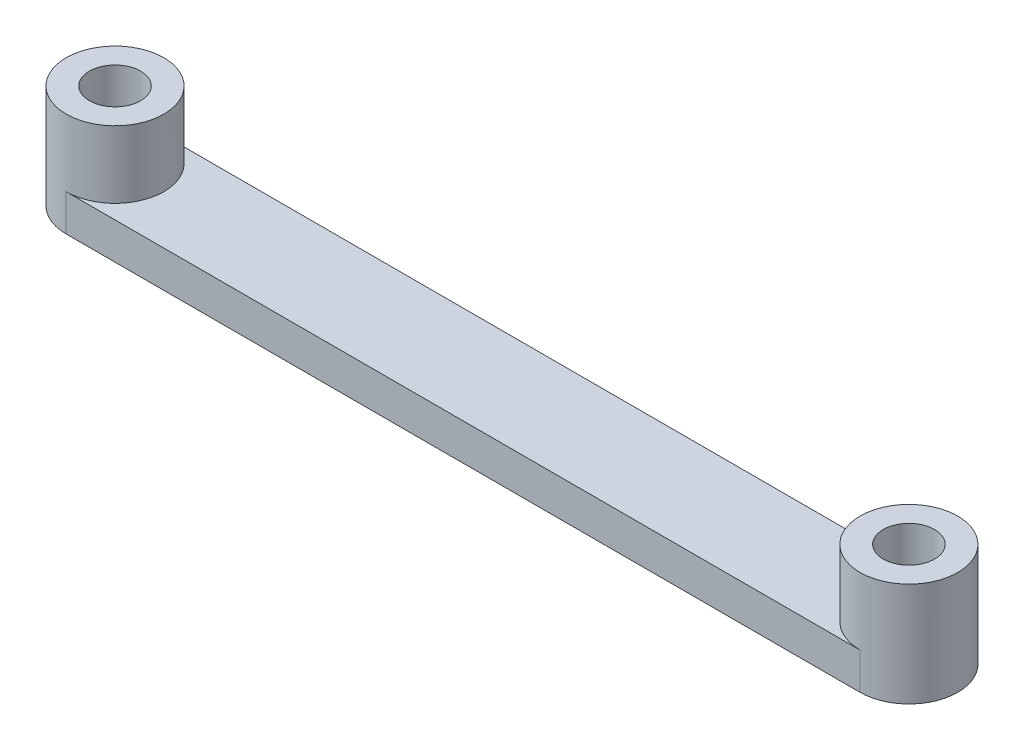
ISO-10303-21;
HEADER;
FILE_DESCRIPTION(('STEP AP214'),'2;1');
FILE_NAME('part.step','',(''),(''),'','','');
FILE_SCHEMA(('AUTOMOTIVE_DESIGN { 1 0 10303 214 1 1 1 1 }'));
ENDSEC;
DATA;
#1=APPLICATION_CONTEXT('core data for automotive mechanical design processes');
#2=APPLICATION_PROTOCOL_DEFINITION('international standard','automotive_design',2000,#1);
#3=PRODUCT_CONTEXT('',#1,'mechanical');
#4=PRODUCT('Part','Part','',(#3));
#5=PRODUCT_RELATED_PRODUCT_CATEGORY('part','',(#4));
#6=PRODUCT_DEFINITION_FORMATION('','',#4);
#7=PRODUCT_DEFINITION_CONTEXT('part definition',#1,'design');
#8=PRODUCT_DEFINITION('design','',#6,#7);
#9=PRODUCT_DEFINITION_SHAPE('','',#8);
#10=(LENGTH_UNIT() NAMED_UNIT(*) SI_UNIT(.MILLI.,.METRE.));
#11=(NAMED_UNIT(*) PLANE_ANGLE_UNIT() SI_UNIT($,.RADIAN.));
#12=(NAMED_UNIT(*) SI_UNIT($,.STERADIAN.) SOLID_ANGLE_UNIT());
#13=UNCERTAINTY_MEASURE_WITH_UNIT(LENGTH_MEASURE(1.E-05),#10,'distance_accuracy_value','');
#14=(GEOMETRIC_REPRESENTATION_CONTEXT(3) GLOBAL_UNCERTAINTY_ASSIGNED_CONTEXT((#13)) GLOBAL_UNIT_ASSIGNED_CONTEXT((#10,
#11,#12)) REPRESENTATION_CONTEXT('',''));
#15=CARTESIAN_POINT('',(0.,0.,0.));
#16=DIRECTION('',(0.,0.,1.));
#17=DIRECTION('',(1.,0.,0.));
#18=AXIS2_PLACEMENT_3D('',#15,#16,#17);
#19=CARTESIAN_POINT('',(0.,3.,0.));
#20=DIRECTION('',(0.,1.,0.));
#21=DIRECTION('',(0.,0.,1.));
#22=AXIS2_PLACEMENT_3D('',#19,#20,#21);
#23=PLANE('',#22);
#24=DIRECTION('',(1.,0.,0.));
#25=VECTOR('',#24,1.);
#26=CARTESIAN_POINT('',(0.,3.,4.));
#27=LINE('',#26,#25);
#28=CARTESIAN_POINT('',(0.,3.,4.));
#29=VERTEX_POINT('',#28);
#30=CARTESIAN_POINT('',(65.,3.,4.));
#31=VERTEX_POINT('',#30);
#32=EDGE_CURVE('E88',#29,#31,#27,.T.);
#33=ORIENTED_EDGE('',*,*,#32,.T.);
#34=CARTESIAN_POINT('',(65.,3.,0.));
#35=DIRECTION('',(0.,1.,0.));
#36=DIRECTION('',(0.,0.,1.));
#37=AXIS2_PLACEMENT_3D('',#34,#35,#36);
#38=CIRCLE('',#37,3.99999999999999);
#39=CARTESIAN_POINT('',(65.,3.,-3.99999999999999));
#40=VERTEX_POINT('',#39);
#41=EDGE_CURVE('E11',#31,#40,#38,.F.);
#42=ORIENTED_EDGE('',*,*,#41,.T.);
#43=DIRECTION('',(-1.,0.,0.));
#44=VECTOR('',#43,1.);
#45=CARTESIAN_POINT('',(0.,3.,-4.));
#46=LINE('',#45,#44);
#47=CARTESIAN_POINT('',(0.,3.,-4.));
#48=VERTEX_POINT('',#47);
#49=EDGE_CURVE('E56',#40,#48,#46,.T.);
#50=ORIENTED_EDGE('',*,*,#49,.T.);
#51=CARTESIAN_POINT('',(0.,3.,0.));
#52=DIRECTION('',(0.,1.,0.));
#53=DIRECTION('',(0.,0.,1.));
#54=AXIS2_PLACEMENT_3D('',#51,#52,#53);
#55=CIRCLE('',#54,4.);
#56=EDGE_CURVE('E95',#29,#48,#55,.T.);
#57=ORIENTED_EDGE('',*,*,#56,.F.);
#58=EDGE_LOOP('',(#33,#42,#50,#57));
#59=FACE_BOUND('',#58,.T.);
#60=ADVANCED_FACE('F39',(#59),#23,.T.);
#61=CARTESIAN_POINT('',(0.,3.,0.));
#62=DIRECTION('',(0.,-1.,0.));
#63=DIRECTION('',(0.,0.,-1.));
#64=AXIS2_PLACEMENT_3D('',#61,#62,#63);
#65=CYLINDRICAL_SURFACE('',#64,4.);
#66=CARTESIAN_POINT('',(0.,0.,0.));
#67=DIRECTION('',(0.,1.,0.));
#68=DIRECTION('',(0.,0.,1.));
#69=AXIS2_PLACEMENT_3D('',#66,#67,#68);
#70=CIRCLE('',#69,4.);
#71=CARTESIAN_POINT('',(0.,0.,-4.));
#72=VERTEX_POINT('',#71);
#73=CARTESIAN_POINT('',(0.,0.,4.));
#74=VERTEX_POINT('',#73);
#75=EDGE_CURVE('E94',#72,#74,#70,.T.);
#76=ORIENTED_EDGE('',*,*,#75,.T.);
#77=DIRECTION('',(0.,-1.,0.));
#78=VECTOR('',#77,1.);
#79=CARTESIAN_POINT('',(0.,3.,4.));
#80=LINE('',#79,#78);
#81=EDGE_CURVE('E49',#29,#74,#80,.T.);
#82=ORIENTED_EDGE('',*,*,#81,.F.);
#83=ORIENTED_EDGE('',*,*,#56,.T.);
#84=DIRECTION('',(0.,-1.,0.));
#85=VECTOR('',#84,1.);
#86=CARTESIAN_POINT('',(0.,3.,-4.));
#87=LINE('',#86,#85);
#88=EDGE_CURVE('E82',#48,#72,#87,.T.);
#89=ORIENTED_EDGE('',*,*,#88,.T.);
#90=EDGE_LOOP('',(#76,#82,#83,#89));
#91=FACE_BOUND('',#90,.T.);
#92=CARTESIAN_POINT('',(0.,8.5,0.));
#93=DIRECTION('',(0.,1.,0.));
#94=DIRECTION('',(0.,0.,1.));
#95=AXIS2_PLACEMENT_3D('',#92,#93,#94);
#96=CIRCLE('',#95,4.);
#97=CARTESIAN_POINT('',(0.,8.5,4.));
#98=VERTEX_POINT('',#97);
#99=EDGE_CURVE('E102',#98,#98,#96,.T.);
#100=ORIENTED_EDGE('',*,*,#99,.F.);
#101=EDGE_LOOP('',(#100));
#102=FACE_BOUND('',#101,.T.);
#103=ADVANCED_FACE('F41',(#91,#102),#65,.T.);
#104=CARTESIAN_POINT('',(0.,3.,4.));
#105=DIRECTION('',(0.,0.,-1.));
#106=DIRECTION('',(-1.,0.,0.));
#107=AXIS2_PLACEMENT_3D('',#104,#105,#106);
#108=PLANE('',#107);
#109=DIRECTION('',(1.,0.,0.));
#110=VECTOR('',#109,1.);
#111=CARTESIAN_POINT('',(0.,0.,4.));
#112=LINE('',#111,#110);
#113=CARTESIAN_POINT('',(65.,0.,4.));
#114=VERTEX_POINT('',#113);
#115=EDGE_CURVE('E99',#74,#114,#112,.T.);
#116=ORIENTED_EDGE('',*,*,#115,.T.);
#117=DIRECTION('',(0.,-1.,0.));
#118=VECTOR('',#117,1.);
#119=CARTESIAN_POINT('',(65.,3.,4.));
#120=LINE('',#119,#118);
#121=EDGE_CURVE('E116',#31,#114,#120,.T.);
#122=ORIENTED_EDGE('',*,*,#121,.F.);
#123=ORIENTED_EDGE('',*,*,#32,.F.);
#124=ORIENTED_EDGE('',*,*,#81,.T.);
#125=EDGE_LOOP('',(#116,#122,#123,#124));
#126=FACE_BOUND('',#125,.T.);
#127=ADVANCED_FACE('F121',(#126),#108,.F.);
#128=CARTESIAN_POINT('',(65.,3.,0.));
#129=DIRECTION('',(0.,-1.,0.));
#130=DIRECTION('',(0.,0.,-1.));
#131=AXIS2_PLACEMENT_3D('',#128,#129,#130);
#132=CYLINDRICAL_SURFACE('',#131,4.);
#133=CARTESIAN_POINT('',(65.,0.,0.));
#134=DIRECTION('',(0.,1.,0.));
#135=DIRECTION('',(0.,0.,1.));
#136=AXIS2_PLACEMENT_3D('',#133,#134,#135);
#137=CIRCLE('',#136,4.);
#138=CARTESIAN_POINT('',(65.,0.,-4.));
#139=VERTEX_POINT('',#138);
#140=EDGE_CURVE('E74',#114,#139,#137,.T.);
#141=ORIENTED_EDGE('',*,*,#140,.T.);
#142=DIRECTION('',(0.,-1.,0.));
#143=VECTOR('',#142,1.);
#144=CARTESIAN_POINT('',(65.,3.,-4.));
#145=LINE('',#144,#143);
#146=EDGE_CURVE('E84',#40,#139,#145,.T.);
#147=ORIENTED_EDGE('',*,*,#146,.F.);
#148=ORIENTED_EDGE('',*,*,#41,.F.);
#149=ORIENTED_EDGE('',*,*,#121,.T.);
#150=EDGE_LOOP('',(#141,#147,#148,#149));
#151=FACE_BOUND('',#150,.T.);
#152=CARTESIAN_POINT('',(65.,8.5,0.));
#153=DIRECTION('',(0.,1.,0.));
#154=DIRECTION('',(0.,0.,1.));
#155=AXIS2_PLACEMENT_3D('',#152,#153,#154);
#156=CIRCLE('',#155,3.99999999999999);
#157=CARTESIAN_POINT('',(65.,8.5,3.99999999999999));
#158=VERTEX_POINT('',#157);
#159=EDGE_CURVE('E132',#158,#158,#156,.T.);
#160=ORIENTED_EDGE('',*,*,#159,.F.);
#161=EDGE_LOOP('',(#160));
#162=FACE_BOUND('',#161,.T.);
#163=ADVANCED_FACE('F127',(#151,#162),#132,.T.);
#164=CARTESIAN_POINT('',(0.,3.,-4.));
#165=DIRECTION('',(0.,0.,1.));
#166=DIRECTION('',(1.,0.,0.));
#167=AXIS2_PLACEMENT_3D('',#164,#165,#166);
#168=PLANE('',#167);
#169=DIRECTION('',(-1.,0.,0.));
#170=VECTOR('',#169,1.);
#171=CARTESIAN_POINT('',(0.,0.,-4.));
#172=LINE('',#171,#170);
#173=EDGE_CURVE('E79',#139,#72,#172,.T.);
#174=ORIENTED_EDGE('',*,*,#173,.T.);
#175=ORIENTED_EDGE('',*,*,#88,.F.);
#176=ORIENTED_EDGE('',*,*,#49,.F.);
#177=ORIENTED_EDGE('',*,*,#146,.T.);
#178=EDGE_LOOP('',(#174,#175,#176,#177));
#179=FACE_BOUND('',#178,.T.);
#180=ADVANCED_FACE('F81',(#179),#168,.F.);
#181=CARTESIAN_POINT('',(0.,0.,0.));
#182=DIRECTION('',(0.,1.,0.));
#183=DIRECTION('',(0.,0.,1.));
#184=AXIS2_PLACEMENT_3D('',#181,#182,#183);
#185=PLANE('',#184);
#186=CARTESIAN_POINT('',(0.,0.,0.));
#187=DIRECTION('',(0.,1.,0.));
#188=DIRECTION('',(0.,0.,1.));
#189=AXIS2_PLACEMENT_3D('',#186,#187,#188);
#190=CIRCLE('',#189,2.1);
#191=CARTESIAN_POINT('',(0.,0.,2.1));
#192=VERTEX_POINT('',#191);
#193=EDGE_CURVE('E137',#192,#192,#190,.T.);
#194=ORIENTED_EDGE('',*,*,#193,.T.);
#195=EDGE_LOOP('',(#194));
#196=FACE_BOUND('',#195,.T.);
#197=CARTESIAN_POINT('',(65.,0.,0.));
#198=DIRECTION('',(0.,1.,0.));
#199=DIRECTION('',(0.,0.,1.));
#200=AXIS2_PLACEMENT_3D('',#197,#198,#199);
#201=CIRCLE('',#200,2.1);
#202=CARTESIAN_POINT('',(65.,0.,2.1));
#203=VERTEX_POINT('',#202);
#204=EDGE_CURVE('E142',#203,#203,#201,.T.);
#205=ORIENTED_EDGE('',*,*,#204,.T.);
#206=EDGE_LOOP('',(#205));
#207=FACE_BOUND('',#206,.T.);
#208=ORIENTED_EDGE('',*,*,#75,.F.);
#209=ORIENTED_EDGE('',*,*,#173,.F.);
#210=ORIENTED_EDGE('',*,*,#140,.F.);
#211=ORIENTED_EDGE('',*,*,#115,.F.);
#212=EDGE_LOOP('',(#208,#209,#210,#211));
#213=FACE_BOUND('',#212,.T.);
#214=ADVANCED_FACE('F98',(#196,#207,#213),#185,.F.);
#215=CARTESIAN_POINT('',(0.,8.5,0.));
#216=DIRECTION('',(0.,1.,0.));
#217=DIRECTION('',(0.,0.,1.));
#218=AXIS2_PLACEMENT_3D('',#215,#216,#217);
#219=PLANE('',#218);
#220=CARTESIAN_POINT('',(0.,8.5,0.));
#221=DIRECTION('',(0.,1.,0.));
#222=DIRECTION('',(0.,0.,1.));
#223=AXIS2_PLACEMENT_3D('',#220,#221,#222);
#224=CIRCLE('',#223,2.1);
#225=CARTESIAN_POINT('',(0.,8.5,2.1));
#226=VERTEX_POINT('',#225);
#227=EDGE_CURVE('E146',#226,#226,#224,.T.);
#228=ORIENTED_EDGE('',*,*,#227,.F.);
#229=EDGE_LOOP('',(#228));
#230=FACE_BOUND('',#229,.T.);
#231=ORIENTED_EDGE('',*,*,#99,.T.);
#232=EDGE_LOOP('',(#231));
#233=FACE_BOUND('',#232,.T.);
#234=ADVANCED_FACE('F163',(#230,#233),#219,.T.);
#235=CARTESIAN_POINT('',(65.,8.5,0.));
#236=DIRECTION('',(0.,1.,0.));
#237=DIRECTION('',(0.,0.,1.));
#238=AXIS2_PLACEMENT_3D('',#235,#236,#237);
#239=PLANE('',#238);
#240=CARTESIAN_POINT('',(65.,8.5,0.));
#241=DIRECTION('',(0.,1.,0.));
#242=DIRECTION('',(0.,0.,1.));
#243=AXIS2_PLACEMENT_3D('',#240,#241,#242);
#244=CIRCLE('',#243,2.1);
#245=CARTESIAN_POINT('',(65.,8.5,2.1));
#246=VERTEX_POINT('',#245);
#247=EDGE_CURVE('E138',#246,#246,#244,.T.);
#248=ORIENTED_EDGE('',*,*,#247,.F.);
#249=EDGE_LOOP('',(#248));
#250=FACE_BOUND('',#249,.T.);
#251=ORIENTED_EDGE('',*,*,#159,.T.);
#252=EDGE_LOOP('',(#251));
#253=FACE_BOUND('',#252,.T.);
#254=ADVANCED_FACE('F166',(#250,#253),#239,.T.);
#255=CARTESIAN_POINT('',(65.,0.,0.));
#256=DIRECTION('',(0.,1.,0.));
#257=DIRECTION('',(0.,0.,1.));
#258=AXIS2_PLACEMENT_3D('',#255,#256,#257);
#259=CYLINDRICAL_SURFACE('',#258,2.1);
#260=ORIENTED_EDGE('',*,*,#204,.F.);
#261=EDGE_LOOP('',(#260));
#262=FACE_BOUND('',#261,.T.);
#263=ORIENTED_EDGE('',*,*,#247,.T.);
#264=EDGE_LOOP('',(#263));
#265=FACE_BOUND('',#264,.T.);
#266=ADVANCED_FACE('F159',(#262,#265),#259,.F.);
#267=CARTESIAN_POINT('',(0.,0.,0.));
#268=DIRECTION('',(0.,1.,0.));
#269=DIRECTION('',(0.,0.,1.));
#270=AXIS2_PLACEMENT_3D('',#267,#268,#269);
#271=CYLINDRICAL_SURFACE('',#270,2.1);
#272=ORIENTED_EDGE('',*,*,#193,.F.);
#273=EDGE_LOOP('',(#272));
#274=FACE_BOUND('',#273,.T.);
#275=ORIENTED_EDGE('',*,*,#227,.T.);
#276=EDGE_LOOP('',(#275));
#277=FACE_BOUND('',#276,.T.);
#278=ADVANCED_FACE('F156',(#274,#277),#271,.F.);
#279=CLOSED_SHELL('',(#60,#103,#127,#163,#180,#214,#234,#254,#266,#278));
#280=MANIFOLD_SOLID_BREP('B2',#279);
#281=ADVANCED_BREP_SHAPE_REPRESENTATION('',(#18,#280),#14);
#282=SHAPE_DEFINITION_REPRESENTATION(#9,#281);
ENDSEC;
END-ISO-10303-21;
